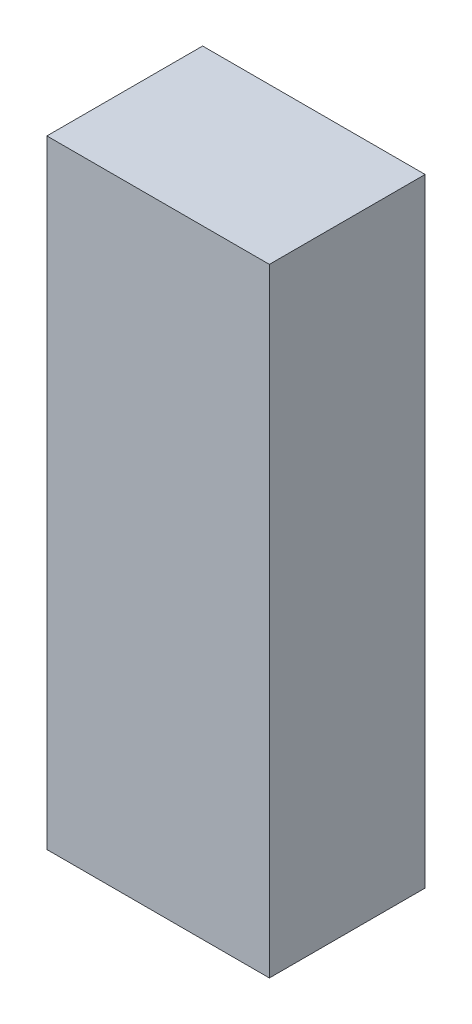
ISO-10303-21;
HEADER;
FILE_DESCRIPTION(('STEP AP214'),'2;1');
FILE_NAME('part.step','',(''),(''),'','','');
FILE_SCHEMA(('AUTOMOTIVE_DESIGN { 1 0 10303 214 1 1 1 1 }'));
ENDSEC;
DATA;
#1=APPLICATION_CONTEXT('core data for automotive mechanical design processes');
#2=APPLICATION_PROTOCOL_DEFINITION('international standard','automotive_design',2000,#1);
#3=PRODUCT_CONTEXT('',#1,'mechanical');
#4=PRODUCT('Part','Part','',(#3));
#5=PRODUCT_RELATED_PRODUCT_CATEGORY('part','',(#4));
#6=PRODUCT_DEFINITION_FORMATION('','',#4);
#7=PRODUCT_DEFINITION_CONTEXT('part definition',#1,'design');
#8=PRODUCT_DEFINITION('design','',#6,#7);
#9=PRODUCT_DEFINITION_SHAPE('','',#8);
#10=(LENGTH_UNIT() NAMED_UNIT(*) SI_UNIT(.MILLI.,.METRE.));
#11=(NAMED_UNIT(*) PLANE_ANGLE_UNIT() SI_UNIT($,.RADIAN.));
#12=(NAMED_UNIT(*) SI_UNIT($,.STERADIAN.) SOLID_ANGLE_UNIT());
#13=UNCERTAINTY_MEASURE_WITH_UNIT(LENGTH_MEASURE(1.E-05),#10,'distance_accuracy_value','');
#14=(GEOMETRIC_REPRESENTATION_CONTEXT(3) GLOBAL_UNCERTAINTY_ASSIGNED_CONTEXT((#13)) GLOBAL_UNIT_ASSIGNED_CONTEXT((#10,
#11,#12)) REPRESENTATION_CONTEXT('',''));
#15=CARTESIAN_POINT('',(0.,0.,0.));
#16=DIRECTION('',(0.,0.,1.));
#17=DIRECTION('',(1.,0.,0.));
#18=AXIS2_PLACEMENT_3D('',#15,#16,#17);
#19=CARTESIAN_POINT('',(-0.5715,-1.5875,0.80000094));
#20=DIRECTION('',(0.,0.,-1.));
#21=DIRECTION('',(-1.,0.,0.));
#22=AXIS2_PLACEMENT_3D('',#19,#20,#21);
#23=PLANE('',#22);
#24=DIRECTION('',(0.,1.,0.));
#25=VECTOR('',#24,1.);
#26=CARTESIAN_POINT('',(0.5715,-1.5875,0.80000094));
#27=LINE('',#26,#25);
#28=CARTESIAN_POINT('',(0.5715,-1.5875,0.80000094));
#29=VERTEX_POINT('',#28);
#30=CARTESIAN_POINT('',(0.5715,1.5875,0.80000094));
#31=VERTEX_POINT('',#30);
#32=EDGE_CURVE('E52',#29,#31,#27,.T.);
#33=ORIENTED_EDGE('',*,*,#32,.T.);
#34=DIRECTION('',(1.,0.,0.));
#35=VECTOR('',#34,1.);
#36=CARTESIAN_POINT('',(0.5715,1.5875,0.80000094));
#37=LINE('',#36,#35);
#38=CARTESIAN_POINT('',(-0.5715,1.5875,0.80000094));
#39=VERTEX_POINT('',#38);
#40=EDGE_CURVE('E55',#31,#39,#37,.F.);
#41=ORIENTED_EDGE('',*,*,#40,.T.);
#42=DIRECTION('',(0.,1.,0.));
#43=VECTOR('',#42,1.);
#44=CARTESIAN_POINT('',(-0.5715,1.5875,0.80000094));
#45=LINE('',#44,#43);
#46=CARTESIAN_POINT('',(-0.5715,-1.5875,0.80000094));
#47=VERTEX_POINT('',#46);
#48=EDGE_CURVE('E57',#39,#47,#45,.F.);
#49=ORIENTED_EDGE('',*,*,#48,.T.);
#50=DIRECTION('',(-1.,0.,0.));
#51=VECTOR('',#50,1.);
#52=CARTESIAN_POINT('',(-0.5715,-1.5875,0.80000094));
#53=LINE('',#52,#51);
#54=EDGE_CURVE('E17',#29,#47,#53,.T.);
#55=ORIENTED_EDGE('',*,*,#54,.F.);
#56=EDGE_LOOP('',(#33,#41,#49,#55));
#57=FACE_BOUND('',#56,.T.);
#58=ADVANCED_FACE('F14',(#57),#23,.F.);
#59=CARTESIAN_POINT('',(-0.5715,1.5875,0.));
#60=DIRECTION('',(1.,0.,0.));
#61=DIRECTION('',(0.,0.,-1.));
#62=AXIS2_PLACEMENT_3D('',#59,#60,#61);
#63=PLANE('',#62);
#64=DIRECTION('',(0.,0.,1.));
#65=VECTOR('',#64,1.);
#66=CARTESIAN_POINT('',(-0.5715,-1.5875,0.));
#67=LINE('',#66,#65);
#68=CARTESIAN_POINT('',(-0.5715,-1.5875,0.));
#69=VERTEX_POINT('',#68);
#70=EDGE_CURVE('E68',#69,#47,#67,.T.);
#71=ORIENTED_EDGE('',*,*,#70,.T.);
#72=ORIENTED_EDGE('',*,*,#48,.F.);
#73=DIRECTION('',(0.,0.,-1.));
#74=VECTOR('',#73,1.);
#75=CARTESIAN_POINT('',(-0.5715,1.5875,0.));
#76=LINE('',#75,#74);
#77=CARTESIAN_POINT('',(-0.5715,1.5875,0.));
#78=VERTEX_POINT('',#77);
#79=EDGE_CURVE('E62',#39,#78,#76,.T.);
#80=ORIENTED_EDGE('',*,*,#79,.T.);
#81=DIRECTION('',(0.,1.,0.));
#82=VECTOR('',#81,1.);
#83=CARTESIAN_POINT('',(-0.5715,-1.5875,0.));
#84=LINE('',#83,#82);
#85=EDGE_CURVE('E80',#69,#78,#84,.T.);
#86=ORIENTED_EDGE('',*,*,#85,.F.);
#87=EDGE_LOOP('',(#71,#72,#80,#86));
#88=FACE_BOUND('',#87,.T.);
#89=ADVANCED_FACE('F65',(#88),#63,.F.);
#90=CARTESIAN_POINT('',(0.5715,1.5875,0.));
#91=DIRECTION('',(0.,-1.,0.));
#92=DIRECTION('',(0.,0.,-1.));
#93=AXIS2_PLACEMENT_3D('',#90,#91,#92);
#94=PLANE('',#93);
#95=ORIENTED_EDGE('',*,*,#79,.F.);
#96=ORIENTED_EDGE('',*,*,#40,.F.);
#97=DIRECTION('',(0.,0.,1.));
#98=VECTOR('',#97,1.);
#99=CARTESIAN_POINT('',(0.5715,1.5875,0.));
#100=LINE('',#99,#98);
#101=CARTESIAN_POINT('',(0.5715,1.5875,0.));
#102=VERTEX_POINT('',#101);
#103=EDGE_CURVE('E74',#31,#102,#100,.F.);
#104=ORIENTED_EDGE('',*,*,#103,.T.);
#105=DIRECTION('',(-1.,0.,0.));
#106=VECTOR('',#105,1.);
#107=CARTESIAN_POINT('',(-0.5715,1.5875,0.));
#108=LINE('',#107,#106);
#109=EDGE_CURVE('E71',#78,#102,#108,.F.);
#110=ORIENTED_EDGE('',*,*,#109,.F.);
#111=EDGE_LOOP('',(#95,#96,#104,#110));
#112=FACE_BOUND('',#111,.T.);
#113=ADVANCED_FACE('F69',(#112),#94,.F.);
#114=CARTESIAN_POINT('',(0.5715,-1.5875,0.));
#115=DIRECTION('',(-1.,0.,0.));
#116=DIRECTION('',(0.,0.,1.));
#117=AXIS2_PLACEMENT_3D('',#114,#115,#116);
#118=PLANE('',#117);
#119=ORIENTED_EDGE('',*,*,#103,.F.);
#120=ORIENTED_EDGE('',*,*,#32,.F.);
#121=DIRECTION('',(0.,0.,1.));
#122=VECTOR('',#121,1.);
#123=CARTESIAN_POINT('',(0.5715,-1.5875,0.));
#124=LINE('',#123,#122);
#125=CARTESIAN_POINT('',(0.5715,-1.5875,0.));
#126=VERTEX_POINT('',#125);
#127=EDGE_CURVE('E32',#29,#126,#124,.F.);
#128=ORIENTED_EDGE('',*,*,#127,.T.);
#129=DIRECTION('',(0.,1.,0.));
#130=VECTOR('',#129,1.);
#131=CARTESIAN_POINT('',(0.5715,-1.5875,0.));
#132=LINE('',#131,#130);
#133=EDGE_CURVE('E23',#102,#126,#132,.F.);
#134=ORIENTED_EDGE('',*,*,#133,.F.);
#135=EDGE_LOOP('',(#119,#120,#128,#134));
#136=FACE_BOUND('',#135,.T.);
#137=ADVANCED_FACE('F86',(#136),#118,.F.);
#138=CARTESIAN_POINT('',(-0.5715,-1.5875,0.));
#139=DIRECTION('',(0.,1.,0.));
#140=DIRECTION('',(0.,0.,1.));
#141=AXIS2_PLACEMENT_3D('',#138,#139,#140);
#142=PLANE('',#141);
#143=ORIENTED_EDGE('',*,*,#127,.F.);
#144=ORIENTED_EDGE('',*,*,#54,.T.);
#145=ORIENTED_EDGE('',*,*,#70,.F.);
#146=DIRECTION('',(-1.,0.,0.));
#147=VECTOR('',#146,1.);
#148=CARTESIAN_POINT('',(-0.5715,-1.5875,0.));
#149=LINE('',#148,#147);
#150=EDGE_CURVE('E9',#126,#69,#149,.T.);
#151=ORIENTED_EDGE('',*,*,#150,.F.);
#152=EDGE_LOOP('',(#143,#144,#145,#151));
#153=FACE_BOUND('',#152,.T.);
#154=ADVANCED_FACE('F88',(#153),#142,.F.);
#155=CARTESIAN_POINT('',(-0.5715,-1.5875,0.));
#156=DIRECTION('',(0.,0.,-1.));
#157=DIRECTION('',(-1.,0.,0.));
#158=AXIS2_PLACEMENT_3D('',#155,#156,#157);
#159=PLANE('',#158);
#160=ORIENTED_EDGE('',*,*,#133,.T.);
#161=ORIENTED_EDGE('',*,*,#150,.T.);
#162=ORIENTED_EDGE('',*,*,#85,.T.);
#163=ORIENTED_EDGE('',*,*,#109,.T.);
#164=EDGE_LOOP('',(#160,#161,#162,#163));
#165=FACE_BOUND('',#164,.T.);
#166=ADVANCED_FACE('F85',(#165),#159,.T.);
#167=CLOSED_SHELL('',(#58,#89,#113,#137,#154,#166));
#168=MANIFOLD_SOLID_BREP('B1',#167);
#169=ADVANCED_BREP_SHAPE_REPRESENTATION('',(#18,#168),#14);
#170=SHAPE_DEFINITION_REPRESENTATION(#9,#169);
ENDSEC;
END-ISO-10303-21;
